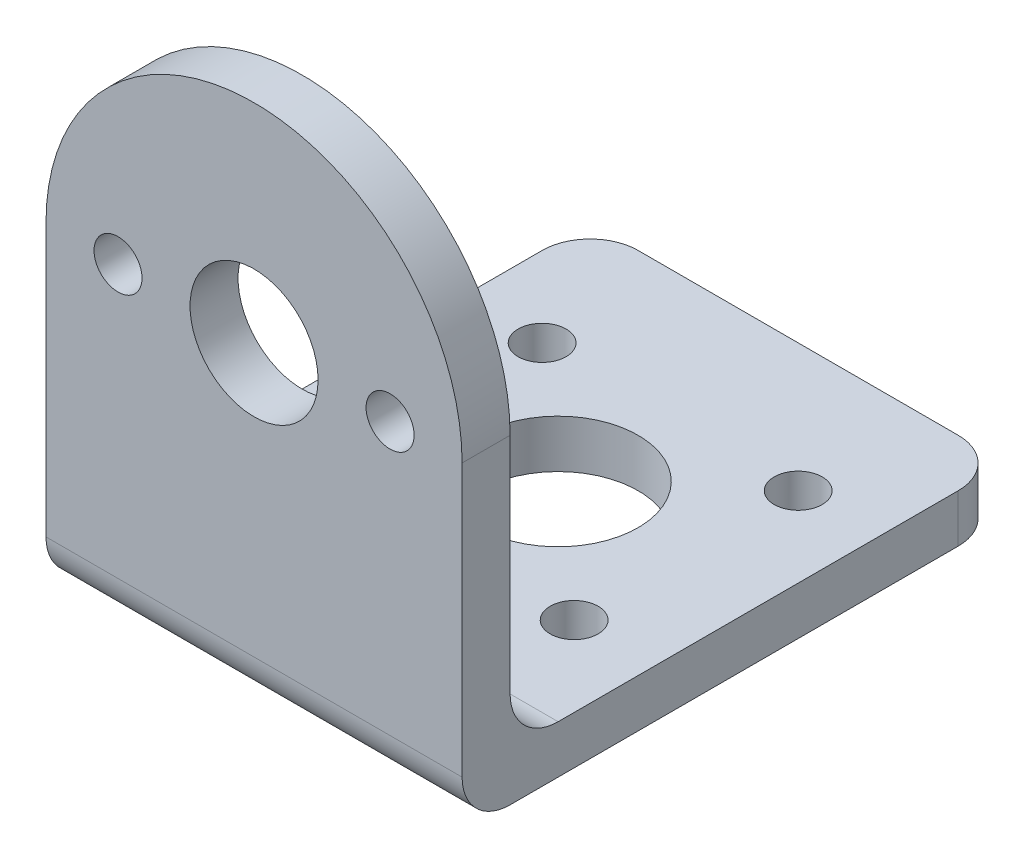
ISO-10303-21;
HEADER;
FILE_DESCRIPTION(('STEP AP214'),'2;1');
FILE_NAME('part.step','',(''),(''),'','','');
FILE_SCHEMA(('AUTOMOTIVE_DESIGN { 1 0 10303 214 1 1 1 1 }'));
ENDSEC;
DATA;
#1=APPLICATION_CONTEXT('core data for automotive mechanical design processes');
#2=APPLICATION_PROTOCOL_DEFINITION('international standard','automotive_design',2000,#1);
#3=PRODUCT_CONTEXT('',#1,'mechanical');
#4=PRODUCT('Part','Part','',(#3));
#5=PRODUCT_RELATED_PRODUCT_CATEGORY('part','',(#4));
#6=PRODUCT_DEFINITION_FORMATION('','',#4);
#7=PRODUCT_DEFINITION_CONTEXT('part definition',#1,'design');
#8=PRODUCT_DEFINITION('design','',#6,#7);
#9=PRODUCT_DEFINITION_SHAPE('','',#8);
#10=(LENGTH_UNIT() NAMED_UNIT(*) SI_UNIT(.MILLI.,.METRE.));
#11=(NAMED_UNIT(*) PLANE_ANGLE_UNIT() SI_UNIT($,.RADIAN.));
#12=(NAMED_UNIT(*) SI_UNIT($,.STERADIAN.) SOLID_ANGLE_UNIT());
#13=UNCERTAINTY_MEASURE_WITH_UNIT(LENGTH_MEASURE(1.E-05),#10,'distance_accuracy_value','');
#14=(GEOMETRIC_REPRESENTATION_CONTEXT(3) GLOBAL_UNCERTAINTY_ASSIGNED_CONTEXT((#13)) GLOBAL_UNIT_ASSIGNED_CONTEXT((#10,
#11,#12)) REPRESENTATION_CONTEXT('',''));
#15=CARTESIAN_POINT('',(0.,0.,0.));
#16=DIRECTION('',(0.,0.,1.));
#17=DIRECTION('',(1.,0.,0.));
#18=AXIS2_PLACEMENT_3D('',#15,#16,#17);
#19=CARTESIAN_POINT('',(0.,0.,3.));
#20=DIRECTION('',(0.,0.,1.));
#21=DIRECTION('',(1.,0.,0.));
#22=AXIS2_PLACEMENT_3D('',#19,#20,#21);
#23=PLANE('',#22);
#24=CARTESIAN_POINT('',(-8.5,0.,3.));
#25=DIRECTION('',(0.,0.,1.));
#26=DIRECTION('',(1.,0.,0.));
#27=AXIS2_PLACEMENT_3D('',#24,#25,#26);
#28=CIRCLE('',#27,1.5);
#29=CARTESIAN_POINT('',(-7.,0.,3.));
#30=VERTEX_POINT('',#29);
#31=EDGE_CURVE('E247',#30,#30,#28,.T.);
#32=ORIENTED_EDGE('',*,*,#31,.F.);
#33=EDGE_LOOP('',(#32));
#34=FACE_BOUND('',#33,.T.);
#35=DIRECTION('',(0.,-1.,0.));
#36=VECTOR('',#35,1.);
#37=CARTESIAN_POINT('',(-13.,0.,3.));
#38=LINE('',#37,#36);
#39=CARTESIAN_POINT('',(-13.,0.,3.));
#40=VERTEX_POINT('',#39);
#41=CARTESIAN_POINT('',(-13.,-17.,3.));
#42=VERTEX_POINT('',#41);
#43=EDGE_CURVE('E118',#40,#42,#38,.T.);
#44=ORIENTED_EDGE('',*,*,#43,.T.);
#45=DIRECTION('',(1.,0.,0.));
#46=VECTOR('',#45,1.);
#47=CARTESIAN_POINT('',(13.,-17.,3.));
#48=LINE('',#47,#46);
#49=CARTESIAN_POINT('',(13.,-17.,3.));
#50=VERTEX_POINT('',#49);
#51=EDGE_CURVE('E195',#42,#50,#48,.T.);
#52=ORIENTED_EDGE('',*,*,#51,.T.);
#53=DIRECTION('',(0.,1.,0.));
#54=VECTOR('',#53,1.);
#55=CARTESIAN_POINT('',(13.,0.,3.));
#56=LINE('',#55,#54);
#57=CARTESIAN_POINT('',(13.,0.,3.));
#58=VERTEX_POINT('',#57);
#59=EDGE_CURVE('E130',#50,#58,#56,.T.);
#60=ORIENTED_EDGE('',*,*,#59,.T.);
#61=CARTESIAN_POINT('',(0.,0.,3.));
#62=DIRECTION('',(0.,0.,1.));
#63=DIRECTION('',(1.,0.,0.));
#64=AXIS2_PLACEMENT_3D('',#61,#62,#63);
#65=CIRCLE('',#64,13.);
#66=EDGE_CURVE('E131',#58,#40,#65,.T.);
#67=ORIENTED_EDGE('',*,*,#66,.T.);
#68=EDGE_LOOP('',(#44,#52,#60,#67));
#69=FACE_BOUND('',#68,.T.);
#70=CARTESIAN_POINT('',(0.,0.,3.));
#71=DIRECTION('',(0.,0.,1.));
#72=DIRECTION('',(1.,0.,0.));
#73=AXIS2_PLACEMENT_3D('',#70,#71,#72);
#74=CIRCLE('',#73,4.);
#75=CARTESIAN_POINT('',(4.,0.,3.));
#76=VERTEX_POINT('',#75);
#77=EDGE_CURVE('E253',#76,#76,#74,.T.);
#78=ORIENTED_EDGE('',*,*,#77,.F.);
#79=EDGE_LOOP('',(#78));
#80=FACE_BOUND('',#79,.T.);
#81=CARTESIAN_POINT('',(8.5,0.,3.));
#82=DIRECTION('',(0.,0.,1.));
#83=DIRECTION('',(-1.,0.,0.));
#84=AXIS2_PLACEMENT_3D('',#81,#82,#83);
#85=CIRCLE('',#84,1.5);
#86=CARTESIAN_POINT('',(7.,0.,3.));
#87=VERTEX_POINT('',#86);
#88=EDGE_CURVE('E241',#87,#87,#85,.T.);
#89=ORIENTED_EDGE('',*,*,#88,.F.);
#90=EDGE_LOOP('',(#89));
#91=FACE_BOUND('',#90,.T.);
#92=ADVANCED_FACE('F41',(#34,#69,#80,#91),#23,.T.);
#93=CARTESIAN_POINT('',(0.,0.,0.));
#94=DIRECTION('',(0.,0.,1.));
#95=DIRECTION('',(1.,0.,0.));
#96=AXIS2_PLACEMENT_3D('',#93,#94,#95);
#97=PLANE('',#96);
#98=DIRECTION('',(0.,1.,0.));
#99=VECTOR('',#98,1.);
#100=CARTESIAN_POINT('',(13.,0.,0.));
#101=LINE('',#100,#99);
#102=CARTESIAN_POINT('',(13.,-14.,0.));
#103=VERTEX_POINT('',#102);
#104=CARTESIAN_POINT('',(13.,0.,0.));
#105=VERTEX_POINT('',#104);
#106=EDGE_CURVE('E139',#103,#105,#101,.T.);
#107=ORIENTED_EDGE('',*,*,#106,.F.);
#108=DIRECTION('',(-1.,0.,0.));
#109=VECTOR('',#108,1.);
#110=CARTESIAN_POINT('',(0.,-14.,0.));
#111=LINE('',#110,#109);
#112=CARTESIAN_POINT('',(-13.,-14.,0.));
#113=VERTEX_POINT('',#112);
#114=EDGE_CURVE('E192',#103,#113,#111,.T.);
#115=ORIENTED_EDGE('',*,*,#114,.T.);
#116=DIRECTION('',(0.,-1.,0.));
#117=VECTOR('',#116,1.);
#118=CARTESIAN_POINT('',(-13.,0.,0.));
#119=LINE('',#118,#117);
#120=CARTESIAN_POINT('',(-13.,0.,0.));
#121=VERTEX_POINT('',#120);
#122=EDGE_CURVE('E199',#121,#113,#119,.T.);
#123=ORIENTED_EDGE('',*,*,#122,.F.);
#124=CARTESIAN_POINT('',(0.,0.,0.));
#125=DIRECTION('',(0.,0.,1.));
#126=DIRECTION('',(1.,0.,0.));
#127=AXIS2_PLACEMENT_3D('',#124,#125,#126);
#128=CIRCLE('',#127,13.);
#129=EDGE_CURVE('E143',#105,#121,#128,.T.);
#130=ORIENTED_EDGE('',*,*,#129,.F.);
#131=EDGE_LOOP('',(#107,#115,#123,#130));
#132=FACE_BOUND('',#131,.T.);
#133=CARTESIAN_POINT('',(0.,0.,0.));
#134=DIRECTION('',(0.,0.,1.));
#135=DIRECTION('',(1.,0.,0.));
#136=AXIS2_PLACEMENT_3D('',#133,#134,#135);
#137=CIRCLE('',#136,4.);
#138=CARTESIAN_POINT('',(4.,0.,0.));
#139=VERTEX_POINT('',#138);
#140=EDGE_CURVE('E250',#139,#139,#137,.T.);
#141=ORIENTED_EDGE('',*,*,#140,.T.);
#142=EDGE_LOOP('',(#141));
#143=FACE_BOUND('',#142,.T.);
#144=CARTESIAN_POINT('',(-8.5,0.,0.));
#145=DIRECTION('',(0.,0.,1.));
#146=DIRECTION('',(1.,0.,0.));
#147=AXIS2_PLACEMENT_3D('',#144,#145,#146);
#148=CIRCLE('',#147,1.5);
#149=CARTESIAN_POINT('',(-7.,0.,0.));
#150=VERTEX_POINT('',#149);
#151=EDGE_CURVE('E244',#150,#150,#148,.T.);
#152=ORIENTED_EDGE('',*,*,#151,.T.);
#153=EDGE_LOOP('',(#152));
#154=FACE_BOUND('',#153,.T.);
#155=CARTESIAN_POINT('',(8.5,0.,0.));
#156=DIRECTION('',(0.,0.,1.));
#157=DIRECTION('',(-1.,0.,0.));
#158=AXIS2_PLACEMENT_3D('',#155,#156,#157);
#159=CIRCLE('',#158,1.5);
#160=CARTESIAN_POINT('',(7.,0.,0.));
#161=VERTEX_POINT('',#160);
#162=EDGE_CURVE('E208',#161,#161,#159,.T.);
#163=ORIENTED_EDGE('',*,*,#162,.T.);
#164=EDGE_LOOP('',(#163));
#165=FACE_BOUND('',#164,.T.);
#166=ADVANCED_FACE('F213',(#132,#143,#154,#165),#97,.F.);
#167=CARTESIAN_POINT('',(0.,0.,3.));
#168=DIRECTION('',(0.,0.,-1.));
#169=DIRECTION('',(-1.,0.,0.));
#170=AXIS2_PLACEMENT_3D('',#167,#168,#169);
#171=CYLINDRICAL_SURFACE('',#170,13.);
#172=ORIENTED_EDGE('',*,*,#129,.T.);
#173=DIRECTION('',(0.,0.,-1.));
#174=VECTOR('',#173,1.);
#175=CARTESIAN_POINT('',(-13.,0.,3.));
#176=LINE('',#175,#174);
#177=EDGE_CURVE('E124',#40,#121,#176,.T.);
#178=ORIENTED_EDGE('',*,*,#177,.F.);
#179=ORIENTED_EDGE('',*,*,#66,.F.);
#180=DIRECTION('',(0.,0.,-1.));
#181=VECTOR('',#180,1.);
#182=CARTESIAN_POINT('',(13.,0.,3.));
#183=LINE('',#182,#181);
#184=EDGE_CURVE('E219',#58,#105,#183,.T.);
#185=ORIENTED_EDGE('',*,*,#184,.T.);
#186=EDGE_LOOP('',(#172,#178,#179,#185));
#187=FACE_BOUND('',#186,.T.);
#188=ADVANCED_FACE('F141',(#187),#171,.T.);
#189=CARTESIAN_POINT('',(-13.,0.,3.));
#190=DIRECTION('',(1.,0.,0.));
#191=DIRECTION('',(0.,1.,0.));
#192=AXIS2_PLACEMENT_3D('',#189,#190,#191);
#193=PLANE('',#192);
#194=DIRECTION('',(0.,0.,1.));
#195=VECTOR('',#194,1.);
#196=CARTESIAN_POINT('',(-13.,-17.,-31.));
#197=LINE('',#196,#195);
#198=CARTESIAN_POINT('',(-13.,-17.,-28.));
#199=VERTEX_POINT('',#198);
#200=CARTESIAN_POINT('',(-13.,-17.,-3.));
#201=VERTEX_POINT('',#200);
#202=EDGE_CURVE('E197',#199,#201,#197,.T.);
#203=ORIENTED_EDGE('',*,*,#202,.F.);
#204=DIRECTION('',(0.,-1.,0.));
#205=VECTOR('',#204,1.);
#206=CARTESIAN_POINT('',(-13.,0.,-28.));
#207=LINE('',#206,#205);
#208=CARTESIAN_POINT('',(-13.,-20.,-28.));
#209=VERTEX_POINT('',#208);
#210=EDGE_CURVE('E146',#199,#209,#207,.T.);
#211=ORIENTED_EDGE('',*,*,#210,.T.);
#212=DIRECTION('',(0.,0.,-1.));
#213=VECTOR('',#212,1.);
#214=CARTESIAN_POINT('',(-13.,-20.,3.));
#215=LINE('',#214,#213);
#216=CARTESIAN_POINT('',(-13.,-20.,0.));
#217=VERTEX_POINT('',#216);
#218=EDGE_CURVE('E144',#217,#209,#215,.T.);
#219=ORIENTED_EDGE('',*,*,#218,.F.);
#220=CARTESIAN_POINT('',(-13.,-17.,0.));
#221=DIRECTION('',(1.,0.,0.));
#222=DIRECTION('',(0.,1.,0.));
#223=AXIS2_PLACEMENT_3D('',#220,#221,#222);
#224=CIRCLE('',#223,3.);
#225=EDGE_CURVE('E128',#217,#42,#224,.F.);
#226=ORIENTED_EDGE('',*,*,#225,.T.);
#227=ORIENTED_EDGE('',*,*,#43,.F.);
#228=ORIENTED_EDGE('',*,*,#177,.T.);
#229=ORIENTED_EDGE('',*,*,#122,.T.);
#230=CARTESIAN_POINT('',(-13.,-14.,-3.));
#231=DIRECTION('',(1.,0.,0.));
#232=DIRECTION('',(0.,1.,0.));
#233=AXIS2_PLACEMENT_3D('',#230,#231,#232);
#234=CIRCLE('',#233,3.);
#235=EDGE_CURVE('E49',#113,#201,#234,.T.);
#236=ORIENTED_EDGE('',*,*,#235,.T.);
#237=EDGE_LOOP('',(#203,#211,#219,#226,#227,#228,#229,#236));
#238=FACE_BOUND('',#237,.T.);
#239=ADVANCED_FACE('F121',(#238),#193,.F.);
#240=CARTESIAN_POINT('',(-13.,-20.,3.));
#241=DIRECTION('',(0.,1.,0.));
#242=DIRECTION('',(0.,0.,1.));
#243=AXIS2_PLACEMENT_3D('',#240,#241,#242);
#244=PLANE('',#243);
#245=CARTESIAN_POINT('',(-8.,-20.,-9.));
#246=DIRECTION('',(0.,1.,0.));
#247=DIRECTION('',(0.,0.,-1.));
#248=AXIS2_PLACEMENT_3D('',#245,#246,#247);
#249=CIRCLE('',#248,1.5);
#250=CARTESIAN_POINT('',(-8.,-20.,-10.5));
#251=VERTEX_POINT('',#250);
#252=EDGE_CURVE('E474',#251,#251,#249,.T.);
#253=ORIENTED_EDGE('',*,*,#252,.T.);
#254=EDGE_LOOP('',(#253));
#255=FACE_BOUND('',#254,.T.);
#256=CARTESIAN_POINT('',(8.,-20.,-9.));
#257=DIRECTION('',(0.,1.,0.));
#258=DIRECTION('',(0.,0.,1.));
#259=AXIS2_PLACEMENT_3D('',#256,#257,#258);
#260=CIRCLE('',#259,1.5);
#261=CARTESIAN_POINT('',(8.,-20.,-7.5));
#262=VERTEX_POINT('',#261);
#263=EDGE_CURVE('E477',#262,#262,#260,.T.);
#264=ORIENTED_EDGE('',*,*,#263,.T.);
#265=EDGE_LOOP('',(#264));
#266=FACE_BOUND('',#265,.T.);
#267=CARTESIAN_POINT('',(8.,-20.,-23.));
#268=DIRECTION('',(0.,1.,0.));
#269=DIRECTION('',(0.,0.,-1.));
#270=AXIS2_PLACEMENT_3D('',#267,#268,#269);
#271=CIRCLE('',#270,1.5);
#272=CARTESIAN_POINT('',(8.,-20.,-24.5));
#273=VERTEX_POINT('',#272);
#274=EDGE_CURVE('E471',#273,#273,#271,.T.);
#275=ORIENTED_EDGE('',*,*,#274,.T.);
#276=EDGE_LOOP('',(#275));
#277=FACE_BOUND('',#276,.T.);
#278=CARTESIAN_POINT('',(-8.,-20.,-23.));
#279=DIRECTION('',(0.,1.,0.));
#280=DIRECTION('',(0.,0.,1.));
#281=AXIS2_PLACEMENT_3D('',#278,#279,#280);
#282=CIRCLE('',#281,1.5);
#283=CARTESIAN_POINT('',(-8.,-20.,-21.5));
#284=VERTEX_POINT('',#283);
#285=EDGE_CURVE('E469',#284,#284,#282,.T.);
#286=ORIENTED_EDGE('',*,*,#285,.T.);
#287=EDGE_LOOP('',(#286));
#288=FACE_BOUND('',#287,.T.);
#289=CARTESIAN_POINT('',(0.,-20.,-16.));
#290=DIRECTION('',(0.,1.,0.));
#291=DIRECTION('',(0.,0.,1.));
#292=AXIS2_PLACEMENT_3D('',#289,#290,#291);
#293=CIRCLE('',#292,5.);
#294=CARTESIAN_POINT('',(0.,-20.,-11.));
#295=VERTEX_POINT('',#294);
#296=EDGE_CURVE('E157',#295,#295,#293,.T.);
#297=ORIENTED_EDGE('',*,*,#296,.T.);
#298=EDGE_LOOP('',(#297));
#299=FACE_BOUND('',#298,.T.);
#300=ORIENTED_EDGE('',*,*,#218,.T.);
#301=CARTESIAN_POINT('',(-10.,-20.,-28.));
#302=DIRECTION('',(0.,1.,0.));
#303=DIRECTION('',(0.,0.,1.));
#304=AXIS2_PLACEMENT_3D('',#301,#302,#303);
#305=CIRCLE('',#304,3.);
#306=CARTESIAN_POINT('',(-10.,-20.,-31.));
#307=VERTEX_POINT('',#306);
#308=EDGE_CURVE('E176',#209,#307,#305,.F.);
#309=ORIENTED_EDGE('',*,*,#308,.T.);
#310=DIRECTION('',(1.,0.,0.));
#311=VECTOR('',#310,1.);
#312=CARTESIAN_POINT('',(-13.,-20.,-31.));
#313=LINE('',#312,#311);
#314=CARTESIAN_POINT('',(10.,-20.,-31.));
#315=VERTEX_POINT('',#314);
#316=EDGE_CURVE('E168',#307,#315,#313,.T.);
#317=ORIENTED_EDGE('',*,*,#316,.T.);
#318=CARTESIAN_POINT('',(10.,-20.,-28.));
#319=DIRECTION('',(0.,1.,0.));
#320=DIRECTION('',(0.,0.,1.));
#321=AXIS2_PLACEMENT_3D('',#318,#319,#320);
#322=CIRCLE('',#321,3.);
#323=CARTESIAN_POINT('',(13.,-20.,-28.));
#324=VERTEX_POINT('',#323);
#325=EDGE_CURVE('E174',#315,#324,#322,.F.);
#326=ORIENTED_EDGE('',*,*,#325,.T.);
#327=DIRECTION('',(0.,0.,-1.));
#328=VECTOR('',#327,1.);
#329=CARTESIAN_POINT('',(13.,-20.,3.));
#330=LINE('',#329,#328);
#331=CARTESIAN_POINT('',(13.,-20.,0.));
#332=VERTEX_POINT('',#331);
#333=EDGE_CURVE('E149',#332,#324,#330,.T.);
#334=ORIENTED_EDGE('',*,*,#333,.F.);
#335=DIRECTION('',(1.,0.,0.));
#336=VECTOR('',#335,1.);
#337=CARTESIAN_POINT('',(-13.,-20.,0.));
#338=LINE('',#337,#336);
#339=EDGE_CURVE('E172',#332,#217,#338,.F.);
#340=ORIENTED_EDGE('',*,*,#339,.T.);
#341=EDGE_LOOP('',(#300,#309,#317,#326,#334,#340));
#342=FACE_BOUND('',#341,.T.);
#343=ADVANCED_FACE('F274',(#255,#266,#277,#288,#299,#342),#244,.F.);
#344=CARTESIAN_POINT('',(13.,0.,3.));
#345=DIRECTION('',(-1.,0.,0.));
#346=DIRECTION('',(0.,-1.,0.));
#347=AXIS2_PLACEMENT_3D('',#344,#345,#346);
#348=PLANE('',#347);
#349=ORIENTED_EDGE('',*,*,#333,.T.);
#350=DIRECTION('',(0.,1.,0.));
#351=VECTOR('',#350,1.);
#352=CARTESIAN_POINT('',(13.,0.,-28.));
#353=LINE('',#352,#351);
#354=CARTESIAN_POINT('',(13.,-17.,-28.));
#355=VERTEX_POINT('',#354);
#356=EDGE_CURVE('E189',#324,#355,#353,.T.);
#357=ORIENTED_EDGE('',*,*,#356,.T.);
#358=DIRECTION('',(0.,0.,1.));
#359=VECTOR('',#358,1.);
#360=CARTESIAN_POINT('',(13.,-17.,-31.));
#361=LINE('',#360,#359);
#362=CARTESIAN_POINT('',(13.,-17.,-3.));
#363=VERTEX_POINT('',#362);
#364=EDGE_CURVE('E209',#355,#363,#361,.T.);
#365=ORIENTED_EDGE('',*,*,#364,.T.);
#366=CARTESIAN_POINT('',(13.,-14.,-3.));
#367=DIRECTION('',(-1.,0.,0.));
#368=DIRECTION('',(0.,-1.,0.));
#369=AXIS2_PLACEMENT_3D('',#366,#367,#368);
#370=CIRCLE('',#369,3.);
#371=EDGE_CURVE('E11',#363,#103,#370,.T.);
#372=ORIENTED_EDGE('',*,*,#371,.T.);
#373=ORIENTED_EDGE('',*,*,#106,.T.);
#374=ORIENTED_EDGE('',*,*,#184,.F.);
#375=ORIENTED_EDGE('',*,*,#59,.F.);
#376=CARTESIAN_POINT('',(13.,-17.,0.));
#377=DIRECTION('',(-1.,0.,0.));
#378=DIRECTION('',(0.,-1.,0.));
#379=AXIS2_PLACEMENT_3D('',#376,#377,#378);
#380=CIRCLE('',#379,3.);
#381=EDGE_CURVE('E56',#50,#332,#380,.F.);
#382=ORIENTED_EDGE('',*,*,#381,.T.);
#383=EDGE_LOOP('',(#349,#357,#365,#372,#373,#374,#375,#382));
#384=FACE_BOUND('',#383,.T.);
#385=ADVANCED_FACE('F223',(#384),#348,.F.);
#386=CARTESIAN_POINT('',(0.,0.,3.));
#387=DIRECTION('',(0.,0.,-1.));
#388=DIRECTION('',(-1.,0.,0.));
#389=AXIS2_PLACEMENT_3D('',#386,#387,#388);
#390=CYLINDRICAL_SURFACE('',#389,4.);
#391=ORIENTED_EDGE('',*,*,#77,.T.);
#392=EDGE_LOOP('',(#391));
#393=FACE_BOUND('',#392,.T.);
#394=ORIENTED_EDGE('',*,*,#140,.F.);
#395=EDGE_LOOP('',(#394));
#396=FACE_BOUND('',#395,.T.);
#397=ADVANCED_FACE('F261',(#393,#396),#390,.F.);
#398=CARTESIAN_POINT('',(-8.5,0.,3.));
#399=DIRECTION('',(0.,0.,-1.));
#400=DIRECTION('',(-1.,0.,0.));
#401=AXIS2_PLACEMENT_3D('',#398,#399,#400);
#402=CYLINDRICAL_SURFACE('',#401,1.5);
#403=ORIENTED_EDGE('',*,*,#31,.T.);
#404=EDGE_LOOP('',(#403));
#405=FACE_BOUND('',#404,.T.);
#406=ORIENTED_EDGE('',*,*,#151,.F.);
#407=EDGE_LOOP('',(#406));
#408=FACE_BOUND('',#407,.T.);
#409=ADVANCED_FACE('F263',(#405,#408),#402,.F.);
#410=CARTESIAN_POINT('',(8.5,0.,3.));
#411=DIRECTION('',(0.,0.,-1.));
#412=DIRECTION('',(-1.,0.,0.));
#413=AXIS2_PLACEMENT_3D('',#410,#411,#412);
#414=CYLINDRICAL_SURFACE('',#413,1.5);
#415=ORIENTED_EDGE('',*,*,#88,.T.);
#416=EDGE_LOOP('',(#415));
#417=FACE_BOUND('',#416,.T.);
#418=ORIENTED_EDGE('',*,*,#162,.F.);
#419=EDGE_LOOP('',(#418));
#420=FACE_BOUND('',#419,.T.);
#421=ADVANCED_FACE('F270',(#417,#420),#414,.F.);
#422=CARTESIAN_POINT('',(-13.,-17.,-31.));
#423=DIRECTION('',(0.,1.,0.));
#424=DIRECTION('',(0.,0.,1.));
#425=AXIS2_PLACEMENT_3D('',#422,#423,#424);
#426=PLANE('',#425);
#427=CARTESIAN_POINT('',(-8.,-17.,-9.));
#428=DIRECTION('',(0.,1.,0.));
#429=DIRECTION('',(0.,0.,1.));
#430=AXIS2_PLACEMENT_3D('',#427,#428,#429);
#431=CIRCLE('',#430,1.5);
#432=CARTESIAN_POINT('',(-8.,-17.,-7.5));
#433=VERTEX_POINT('',#432);
#434=EDGE_CURVE('E166',#433,#433,#431,.T.);
#435=ORIENTED_EDGE('',*,*,#434,.F.);
#436=EDGE_LOOP('',(#435));
#437=FACE_BOUND('',#436,.T.);
#438=CARTESIAN_POINT('',(8.,-17.,-9.));
#439=DIRECTION('',(0.,1.,0.));
#440=DIRECTION('',(0.,0.,1.));
#441=AXIS2_PLACEMENT_3D('',#438,#439,#440);
#442=CIRCLE('',#441,1.5);
#443=CARTESIAN_POINT('',(8.,-17.,-7.5));
#444=VERTEX_POINT('',#443);
#445=EDGE_CURVE('E163',#444,#444,#442,.T.);
#446=ORIENTED_EDGE('',*,*,#445,.F.);
#447=EDGE_LOOP('',(#446));
#448=FACE_BOUND('',#447,.T.);
#449=CARTESIAN_POINT('',(8.,-17.,-23.));
#450=DIRECTION('',(0.,1.,0.));
#451=DIRECTION('',(0.,0.,1.));
#452=AXIS2_PLACEMENT_3D('',#449,#450,#451);
#453=CIRCLE('',#452,1.5);
#454=CARTESIAN_POINT('',(8.,-17.,-21.5));
#455=VERTEX_POINT('',#454);
#456=EDGE_CURVE('E160',#455,#455,#453,.T.);
#457=ORIENTED_EDGE('',*,*,#456,.F.);
#458=EDGE_LOOP('',(#457));
#459=FACE_BOUND('',#458,.T.);
#460=CARTESIAN_POINT('',(-8.,-17.,-23.));
#461=DIRECTION('',(0.,1.,0.));
#462=DIRECTION('',(0.,0.,1.));
#463=AXIS2_PLACEMENT_3D('',#460,#461,#462);
#464=CIRCLE('',#463,1.5);
#465=CARTESIAN_POINT('',(-8.,-17.,-21.5));
#466=VERTEX_POINT('',#465);
#467=EDGE_CURVE('E156',#466,#466,#464,.T.);
#468=ORIENTED_EDGE('',*,*,#467,.F.);
#469=EDGE_LOOP('',(#468));
#470=FACE_BOUND('',#469,.T.);
#471=CARTESIAN_POINT('',(0.,-17.,-16.));
#472=DIRECTION('',(0.,1.,0.));
#473=DIRECTION('',(0.,0.,1.));
#474=AXIS2_PLACEMENT_3D('',#471,#472,#473);
#475=CIRCLE('',#474,5.);
#476=CARTESIAN_POINT('',(0.,-17.,-11.));
#477=VERTEX_POINT('',#476);
#478=EDGE_CURVE('E153',#477,#477,#475,.T.);
#479=ORIENTED_EDGE('',*,*,#478,.F.);
#480=EDGE_LOOP('',(#479));
#481=FACE_BOUND('',#480,.T.);
#482=DIRECTION('',(-1.,0.,0.));
#483=VECTOR('',#482,1.);
#484=CARTESIAN_POINT('',(-13.,-17.,-31.));
#485=LINE('',#484,#483);
#486=CARTESIAN_POINT('',(9.99999999999999,-17.,-31.));
#487=VERTEX_POINT('',#486);
#488=CARTESIAN_POINT('',(-10.,-17.,-31.));
#489=VERTEX_POINT('',#488);
#490=EDGE_CURVE('E230',#487,#489,#485,.T.);
#491=ORIENTED_EDGE('',*,*,#490,.T.);
#492=CARTESIAN_POINT('',(-10.,-17.,-28.));
#493=DIRECTION('',(0.,1.,0.));
#494=DIRECTION('',(0.,0.,1.));
#495=AXIS2_PLACEMENT_3D('',#492,#493,#494);
#496=CIRCLE('',#495,3.);
#497=EDGE_CURVE('E186',#489,#199,#496,.T.);
#498=ORIENTED_EDGE('',*,*,#497,.T.);
#499=ORIENTED_EDGE('',*,*,#202,.T.);
#500=DIRECTION('',(-1.,0.,0.));
#501=VECTOR('',#500,1.);
#502=CARTESIAN_POINT('',(-13.,-17.,-3.));
#503=LINE('',#502,#501);
#504=EDGE_CURVE('E182',#201,#363,#503,.F.);
#505=ORIENTED_EDGE('',*,*,#504,.T.);
#506=ORIENTED_EDGE('',*,*,#364,.F.);
#507=CARTESIAN_POINT('',(10.,-17.,-28.));
#508=DIRECTION('',(0.,1.,0.));
#509=DIRECTION('',(0.,0.,1.));
#510=AXIS2_PLACEMENT_3D('',#507,#508,#509);
#511=CIRCLE('',#510,3.);
#512=EDGE_CURVE('E184',#355,#487,#511,.T.);
#513=ORIENTED_EDGE('',*,*,#512,.T.);
#514=EDGE_LOOP('',(#491,#498,#499,#505,#506,#513));
#515=FACE_BOUND('',#514,.T.);
#516=ADVANCED_FACE('F205',(#437,#448,#459,#470,#481,#515),#426,.T.);
#517=CARTESIAN_POINT('',(0.,0.,-31.));
#518=DIRECTION('',(0.,0.,1.));
#519=DIRECTION('',(1.,0.,0.));
#520=AXIS2_PLACEMENT_3D('',#517,#518,#519);
#521=PLANE('',#520);
#522=ORIENTED_EDGE('',*,*,#316,.F.);
#523=DIRECTION('',(0.,-1.,0.));
#524=VECTOR('',#523,1.);
#525=CARTESIAN_POINT('',(-10.,0.,-31.));
#526=LINE('',#525,#524);
#527=EDGE_CURVE('E180',#307,#489,#526,.F.);
#528=ORIENTED_EDGE('',*,*,#527,.T.);
#529=ORIENTED_EDGE('',*,*,#490,.F.);
#530=DIRECTION('',(0.,1.,0.));
#531=VECTOR('',#530,1.);
#532=CARTESIAN_POINT('',(10.,0.,-31.));
#533=LINE('',#532,#531);
#534=EDGE_CURVE('E178',#487,#315,#533,.F.);
#535=ORIENTED_EDGE('',*,*,#534,.T.);
#536=EDGE_LOOP('',(#522,#528,#529,#535));
#537=FACE_BOUND('',#536,.T.);
#538=ADVANCED_FACE('F233',(#537),#521,.F.);
#539=CARTESIAN_POINT('',(0.,-20.,-16.));
#540=DIRECTION('',(0.,1.,0.));
#541=DIRECTION('',(0.,0.,1.));
#542=AXIS2_PLACEMENT_3D('',#539,#540,#541);
#543=CYLINDRICAL_SURFACE('',#542,5.);
#544=ORIENTED_EDGE('',*,*,#478,.T.);
#545=EDGE_LOOP('',(#544));
#546=FACE_BOUND('',#545,.T.);
#547=ORIENTED_EDGE('',*,*,#296,.F.);
#548=EDGE_LOOP('',(#547));
#549=FACE_BOUND('',#548,.T.);
#550=ADVANCED_FACE('F360',(#546,#549),#543,.F.);
#551=CARTESIAN_POINT('',(-8.,-20.,-23.));
#552=DIRECTION('',(0.,1.,0.));
#553=DIRECTION('',(0.,0.,1.));
#554=AXIS2_PLACEMENT_3D('',#551,#552,#553);
#555=CYLINDRICAL_SURFACE('',#554,1.5);
#556=ORIENTED_EDGE('',*,*,#467,.T.);
#557=EDGE_LOOP('',(#556));
#558=FACE_BOUND('',#557,.T.);
#559=ORIENTED_EDGE('',*,*,#285,.F.);
#560=EDGE_LOOP('',(#559));
#561=FACE_BOUND('',#560,.T.);
#562=ADVANCED_FACE('F350',(#558,#561),#555,.F.);
#563=CARTESIAN_POINT('',(8.,-20.,-23.));
#564=DIRECTION('',(0.,1.,0.));
#565=DIRECTION('',(0.,0.,1.));
#566=AXIS2_PLACEMENT_3D('',#563,#564,#565);
#567=CYLINDRICAL_SURFACE('',#566,1.5);
#568=ORIENTED_EDGE('',*,*,#456,.T.);
#569=EDGE_LOOP('',(#568));
#570=FACE_BOUND('',#569,.T.);
#571=ORIENTED_EDGE('',*,*,#274,.F.);
#572=EDGE_LOOP('',(#571));
#573=FACE_BOUND('',#572,.T.);
#574=ADVANCED_FACE('F340',(#570,#573),#567,.F.);
#575=CARTESIAN_POINT('',(8.,-20.,-9.));
#576=DIRECTION('',(0.,1.,0.));
#577=DIRECTION('',(0.,0.,1.));
#578=AXIS2_PLACEMENT_3D('',#575,#576,#577);
#579=CYLINDRICAL_SURFACE('',#578,1.5);
#580=ORIENTED_EDGE('',*,*,#445,.T.);
#581=EDGE_LOOP('',(#580));
#582=FACE_BOUND('',#581,.T.);
#583=ORIENTED_EDGE('',*,*,#263,.F.);
#584=EDGE_LOOP('',(#583));
#585=FACE_BOUND('',#584,.T.);
#586=ADVANCED_FACE('F330',(#582,#585),#579,.F.);
#587=CARTESIAN_POINT('',(-8.,-20.,-9.));
#588=DIRECTION('',(0.,1.,0.));
#589=DIRECTION('',(0.,0.,1.));
#590=AXIS2_PLACEMENT_3D('',#587,#588,#589);
#591=CYLINDRICAL_SURFACE('',#590,1.5);
#592=ORIENTED_EDGE('',*,*,#434,.T.);
#593=EDGE_LOOP('',(#592));
#594=FACE_BOUND('',#593,.T.);
#595=ORIENTED_EDGE('',*,*,#252,.F.);
#596=EDGE_LOOP('',(#595));
#597=FACE_BOUND('',#596,.T.);
#598=ADVANCED_FACE('F295',(#594,#597),#591,.F.);
#599=CARTESIAN_POINT('',(-10.,0.,-28.));
#600=DIRECTION('',(0.,-1.,0.));
#601=DIRECTION('',(1.,0.,0.));
#602=AXIS2_PLACEMENT_3D('',#599,#600,#601);
#603=CYLINDRICAL_SURFACE('',#602,3.);
#604=ORIENTED_EDGE('',*,*,#497,.F.);
#605=ORIENTED_EDGE('',*,*,#527,.F.);
#606=ORIENTED_EDGE('',*,*,#308,.F.);
#607=ORIENTED_EDGE('',*,*,#210,.F.);
#608=EDGE_LOOP('',(#604,#605,#606,#607));
#609=FACE_BOUND('',#608,.T.);
#610=ADVANCED_FACE('F292',(#609),#603,.T.);
#611=CARTESIAN_POINT('',(10.,0.,-28.));
#612=DIRECTION('',(0.,1.,0.));
#613=DIRECTION('',(-1.,0.,0.));
#614=AXIS2_PLACEMENT_3D('',#611,#612,#613);
#615=CYLINDRICAL_SURFACE('',#614,3.);
#616=ORIENTED_EDGE('',*,*,#325,.F.);
#617=ORIENTED_EDGE('',*,*,#534,.F.);
#618=ORIENTED_EDGE('',*,*,#512,.F.);
#619=ORIENTED_EDGE('',*,*,#356,.F.);
#620=EDGE_LOOP('',(#616,#617,#618,#619));
#621=FACE_BOUND('',#620,.T.);
#622=ADVANCED_FACE('F227',(#621),#615,.T.);
#623=CARTESIAN_POINT('',(0.,-14.,-3.));
#624=DIRECTION('',(-1.,0.,0.));
#625=DIRECTION('',(0.,0.,1.));
#626=AXIS2_PLACEMENT_3D('',#623,#624,#625);
#627=CYLINDRICAL_SURFACE('',#626,3.);
#628=ORIENTED_EDGE('',*,*,#371,.F.);
#629=ORIENTED_EDGE('',*,*,#504,.F.);
#630=ORIENTED_EDGE('',*,*,#235,.F.);
#631=ORIENTED_EDGE('',*,*,#114,.F.);
#632=EDGE_LOOP('',(#628,#629,#630,#631));
#633=FACE_BOUND('',#632,.T.);
#634=ADVANCED_FACE('F211',(#633),#627,.F.);
#635=CARTESIAN_POINT('',(0.,-17.,0.));
#636=DIRECTION('',(-1.,0.,0.));
#637=DIRECTION('',(0.,0.,1.));
#638=AXIS2_PLACEMENT_3D('',#635,#636,#637);
#639=CYLINDRICAL_SURFACE('',#638,3.);
#640=ORIENTED_EDGE('',*,*,#225,.F.);
#641=ORIENTED_EDGE('',*,*,#339,.F.);
#642=ORIENTED_EDGE('',*,*,#381,.F.);
#643=ORIENTED_EDGE('',*,*,#51,.F.);
#644=EDGE_LOOP('',(#640,#641,#642,#643));
#645=FACE_BOUND('',#644,.T.);
#646=ADVANCED_FACE('F43',(#645),#639,.T.);
#647=CLOSED_SHELL('',(#92,#166,#188,#239,#343,#385,#397,#409,#421,#516,#538,#550,#562,#574,#586,
#598,#610,#622,#634,#646));
#648=MANIFOLD_SOLID_BREP('B2',#647);
#649=ADVANCED_BREP_SHAPE_REPRESENTATION('',(#18,#648),#14);
#650=SHAPE_DEFINITION_REPRESENTATION(#9,#649);
ENDSEC;
END-ISO-10303-21;
